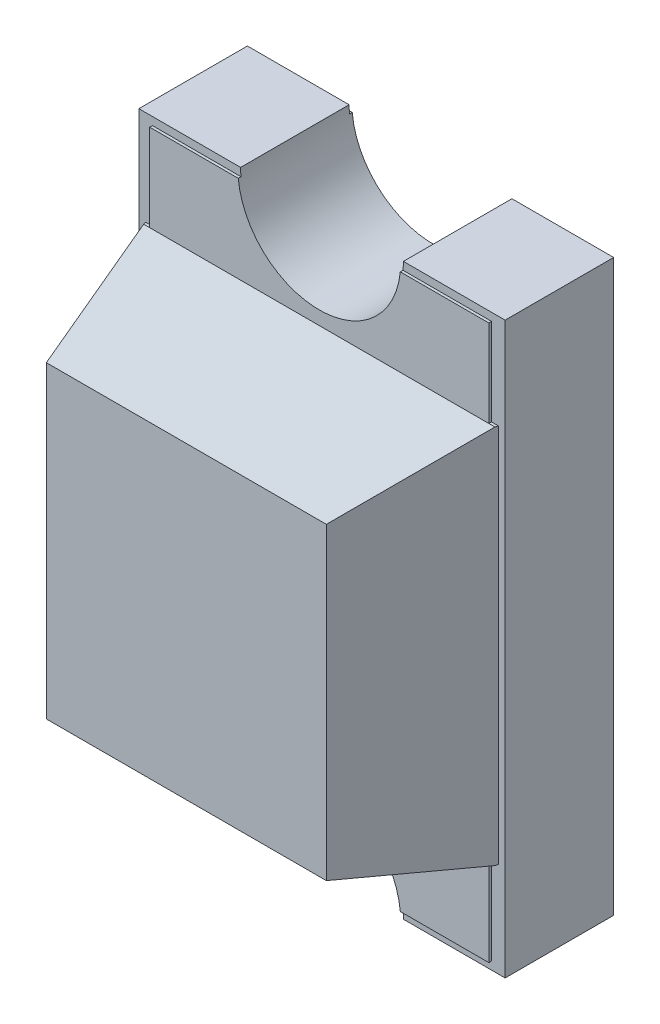
ISO-10303-21;
HEADER;
FILE_DESCRIPTION(('STEP AP214'),'2;1');
FILE_NAME('part.step','',(''),(''),'','','');
FILE_SCHEMA(('AUTOMOTIVE_DESIGN { 1 0 10303 214 1 1 1 1 }'));
ENDSEC;
DATA;
#1=APPLICATION_CONTEXT('core data for automotive mechanical design processes');
#2=APPLICATION_PROTOCOL_DEFINITION('international standard','automotive_design',2000,#1);
#3=PRODUCT_CONTEXT('',#1,'mechanical');
#4=PRODUCT('Part','Part','',(#3));
#5=PRODUCT_RELATED_PRODUCT_CATEGORY('part','',(#4));
#6=PRODUCT_DEFINITION_FORMATION('','',#4);
#7=PRODUCT_DEFINITION_CONTEXT('part definition',#1,'design');
#8=PRODUCT_DEFINITION('design','',#6,#7);
#9=PRODUCT_DEFINITION_SHAPE('','',#8);
#10=(LENGTH_UNIT() NAMED_UNIT(*) SI_UNIT(.MILLI.,.METRE.));
#11=(NAMED_UNIT(*) PLANE_ANGLE_UNIT() SI_UNIT($,.RADIAN.));
#12=(NAMED_UNIT(*) SI_UNIT($,.STERADIAN.) SOLID_ANGLE_UNIT());
#13=UNCERTAINTY_MEASURE_WITH_UNIT(LENGTH_MEASURE(1.E-05),#10,'distance_accuracy_value','');
#14=(GEOMETRIC_REPRESENTATION_CONTEXT(3) GLOBAL_UNCERTAINTY_ASSIGNED_CONTEXT((#13)) GLOBAL_UNIT_ASSIGNED_CONTEXT((#10,
#11,#12)) REPRESENTATION_CONTEXT('',''));
#15=CARTESIAN_POINT('',(0.,0.,0.));
#16=DIRECTION('',(0.,0.,1.));
#17=DIRECTION('',(1.,0.,0.));
#18=AXIS2_PLACEMENT_3D('',#15,#16,#17);
#19=CARTESIAN_POINT('',(-0.65,0.7,0.9));
#20=DIRECTION('',(0.,-1.,0.));
#21=DIRECTION('',(0.,0.,-1.));
#22=AXIS2_PLACEMENT_3D('',#19,#20,#21);
#23=PLANE('',#22);
#24=DIRECTION('',(0.258819045102514,0.,0.96592582628907));
#25=VECTOR('',#24,1.);
#26=CARTESIAN_POINT('',(-0.525000000000003,0.7,0.866506350946111));
#27=LINE('',#26,#25);
#28=CARTESIAN_POINT('',(-0.65,0.7,0.4));
#29=VERTEX_POINT('',#28);
#30=CARTESIAN_POINT('',(-0.647320508075689,0.7,0.41));
#31=VERTEX_POINT('',#30);
#32=EDGE_CURVE('E300',#29,#31,#27,.T.);
#33=ORIENTED_EDGE('',*,*,#32,.T.);
#34=DIRECTION('',(-1.,0.,0.));
#35=VECTOR('',#34,1.);
#36=CARTESIAN_POINT('',(0.675,0.7,0.41));
#37=LINE('',#36,#35);
#38=CARTESIAN_POINT('',(-0.625,0.7,0.41));
#39=VERTEX_POINT('',#38);
#40=EDGE_CURVE('E290',#39,#31,#37,.T.);
#41=ORIENTED_EDGE('',*,*,#40,.F.);
#42=DIRECTION('',(0.,0.,1.));
#43=VECTOR('',#42,1.);
#44=CARTESIAN_POINT('',(-0.625,0.7,-0.00999999999999997));
#45=LINE('',#44,#43);
#46=CARTESIAN_POINT('',(-0.625,0.7,0.4));
#47=VERTEX_POINT('',#46);
#48=EDGE_CURVE('E324',#47,#39,#45,.T.);
#49=ORIENTED_EDGE('',*,*,#48,.F.);
#50=DIRECTION('',(-1.,0.,0.));
#51=VECTOR('',#50,1.);
#52=CARTESIAN_POINT('',(-0.65,0.7,0.4));
#53=LINE('',#52,#51);
#54=EDGE_CURVE('E314',#47,#29,#53,.T.);
#55=ORIENTED_EDGE('',*,*,#54,.T.);
#56=EDGE_LOOP('',(#33,#41,#49,#55));
#57=FACE_BOUND('',#56,.T.);
#58=ADVANCED_FACE('F34',(#57),#23,.F.);
#59=CARTESIAN_POINT('',(-0.65,-0.7,0.9));
#60=DIRECTION('',(0.,1.,0.));
#61=DIRECTION('',(0.,0.,1.));
#62=AXIS2_PLACEMENT_3D('',#59,#60,#61);
#63=PLANE('',#62);
#64=DIRECTION('',(0.258819045102514,0.,-0.96592582628907));
#65=VECTOR('',#64,1.);
#66=CARTESIAN_POINT('',(0.65,-0.7,0.4));
#67=LINE('',#66,#65);
#68=CARTESIAN_POINT('',(0.647320508075689,-0.7,0.41));
#69=VERTEX_POINT('',#68);
#70=CARTESIAN_POINT('',(0.65,-0.7,0.4));
#71=VERTEX_POINT('',#70);
#72=EDGE_CURVE('E297',#69,#71,#67,.T.);
#73=ORIENTED_EDGE('',*,*,#72,.F.);
#74=DIRECTION('',(-1.,0.,0.));
#75=VECTOR('',#74,1.);
#76=CARTESIAN_POINT('',(0.675,-0.7,0.41));
#77=LINE('',#76,#75);
#78=CARTESIAN_POINT('',(0.625,-0.7,0.41));
#79=VERTEX_POINT('',#78);
#80=EDGE_CURVE('E56',#69,#79,#77,.T.);
#81=ORIENTED_EDGE('',*,*,#80,.T.);
#82=DIRECTION('',(0.,0.,1.));
#83=VECTOR('',#82,1.);
#84=CARTESIAN_POINT('',(0.625,-0.7,-0.00999999999999997));
#85=LINE('',#84,#83);
#86=CARTESIAN_POINT('',(0.625,-0.7,0.4));
#87=VERTEX_POINT('',#86);
#88=EDGE_CURVE('E317',#87,#79,#85,.T.);
#89=ORIENTED_EDGE('',*,*,#88,.F.);
#90=DIRECTION('',(1.,0.,0.));
#91=VECTOR('',#90,1.);
#92=CARTESIAN_POINT('',(-0.65,-0.7,0.4));
#93=LINE('',#92,#91);
#94=EDGE_CURVE('E310',#87,#71,#93,.T.);
#95=ORIENTED_EDGE('',*,*,#94,.T.);
#96=EDGE_LOOP('',(#73,#81,#89,#95));
#97=FACE_BOUND('',#96,.T.);
#98=ADVANCED_FACE('F543',(#97),#63,.F.);
#99=CARTESIAN_POINT('',(0.,0.,0.4));
#100=DIRECTION('',(0.,0.,1.));
#101=DIRECTION('',(1.,0.,0.));
#102=AXIS2_PLACEMENT_3D('',#99,#100,#101);
#103=PLANE('',#102);
#104=DIRECTION('',(-1.,0.,0.));
#105=VECTOR('',#104,1.);
#106=CARTESIAN_POINT('',(-0.675,1.05,0.4));
#107=LINE('',#106,#105);
#108=CARTESIAN_POINT('',(-0.3,1.05,0.4));
#109=VERTEX_POINT('',#108);
#110=CARTESIAN_POINT('',(-0.675,1.05,0.4));
#111=VERTEX_POINT('',#110);
#112=EDGE_CURVE('E478',#109,#111,#107,.T.);
#113=ORIENTED_EDGE('',*,*,#112,.T.);
#114=DIRECTION('',(0.,-1.,0.));
#115=VECTOR('',#114,1.);
#116=CARTESIAN_POINT('',(-0.675,1.05,0.4));
#117=LINE('',#116,#115);
#118=CARTESIAN_POINT('',(-0.675,-1.05,0.4));
#119=VERTEX_POINT('',#118);
#120=EDGE_CURVE('E469',#111,#119,#117,.T.);
#121=ORIENTED_EDGE('',*,*,#120,.T.);
#122=DIRECTION('',(1.,0.,0.));
#123=VECTOR('',#122,1.);
#124=CARTESIAN_POINT('',(-0.675,-1.05,0.4));
#125=LINE('',#124,#123);
#126=CARTESIAN_POINT('',(-0.3,-1.05,0.4));
#127=VERTEX_POINT('',#126);
#128=EDGE_CURVE('E473',#119,#127,#125,.T.);
#129=ORIENTED_EDGE('',*,*,#128,.T.);
#130=CARTESIAN_POINT('',(0.,-1.05,0.4));
#131=DIRECTION('',(0.,0.,1.));
#132=DIRECTION('',(1.,0.,0.));
#133=AXIS2_PLACEMENT_3D('',#130,#131,#132);
#134=CIRCLE('',#133,0.3);
#135=CARTESIAN_POINT('',(-0.298588988795972,-1.02093772600433,0.4));
#136=VERTEX_POINT('',#135);
#137=EDGE_CURVE('E334',#136,#127,#134,.T.);
#138=ORIENTED_EDGE('',*,*,#137,.F.);
#139=DIRECTION('',(1.,0.,0.));
#140=VECTOR('',#139,1.);
#141=CARTESIAN_POINT('',(0.,-1.02093772600433,0.4));
#142=LINE('',#141,#140);
#143=CARTESIAN_POINT('',(-0.625,-1.02093772600433,0.4));
#144=VERTEX_POINT('',#143);
#145=EDGE_CURVE('E421',#144,#136,#142,.T.);
#146=ORIENTED_EDGE('',*,*,#145,.F.);
#147=DIRECTION('',(0.,-1.,0.));
#148=VECTOR('',#147,1.);
#149=CARTESIAN_POINT('',(-0.625,0.,0.4));
#150=LINE('',#149,#148);
#151=CARTESIAN_POINT('',(-0.625,-0.7,0.4));
#152=VERTEX_POINT('',#151);
#153=EDGE_CURVE('E418',#152,#144,#150,.T.);
#154=ORIENTED_EDGE('',*,*,#153,.F.);
#155=CARTESIAN_POINT('',(-0.65,-0.7,0.4));
#156=VERTEX_POINT('',#155);
#157=EDGE_CURVE('E311',#156,#152,#93,.T.);
#158=ORIENTED_EDGE('',*,*,#157,.F.);
#159=DIRECTION('',(0.,-1.,0.));
#160=VECTOR('',#159,1.);
#161=CARTESIAN_POINT('',(-0.65,0.7,0.4));
#162=LINE('',#161,#160);
#163=EDGE_CURVE('E308',#29,#156,#162,.T.);
#164=ORIENTED_EDGE('',*,*,#163,.F.);
#165=ORIENTED_EDGE('',*,*,#54,.F.);
#166=DIRECTION('',(0.,-1.,0.));
#167=VECTOR('',#166,1.);
#168=CARTESIAN_POINT('',(-0.625,0.,0.4));
#169=LINE('',#168,#167);
#170=CARTESIAN_POINT('',(-0.625,1.02093772600433,0.4));
#171=VERTEX_POINT('',#170);
#172=EDGE_CURVE('E465',#171,#47,#169,.T.);
#173=ORIENTED_EDGE('',*,*,#172,.F.);
#174=DIRECTION('',(-1.,0.,0.));
#175=VECTOR('',#174,1.);
#176=CARTESIAN_POINT('',(0.,1.02093772600433,0.4));
#177=LINE('',#176,#175);
#178=CARTESIAN_POINT('',(-0.298588988795971,1.02093772600433,0.4));
#179=VERTEX_POINT('',#178);
#180=EDGE_CURVE('E461',#179,#171,#177,.T.);
#181=ORIENTED_EDGE('',*,*,#180,.F.);
#182=CARTESIAN_POINT('',(0.,1.05,0.4));
#183=DIRECTION('',(0.,0.,1.));
#184=DIRECTION('',(1.,0.,0.));
#185=AXIS2_PLACEMENT_3D('',#182,#183,#184);
#186=CIRCLE('',#185,0.3);
#187=EDGE_CURVE('E364',#109,#179,#186,.T.);
#188=ORIENTED_EDGE('',*,*,#187,.F.);
#189=EDGE_LOOP('',(#113,#121,#129,#138,#146,#154,#158,#164,#165,#173,#181,#188));
#190=FACE_BOUND('',#189,.T.);
#191=ADVANCED_FACE('F572',(#190),#103,.T.);
#192=CARTESIAN_POINT('',(0.65,0.7,0.4));
#193=VERTEX_POINT('',#192);
#194=CARTESIAN_POINT('',(0.625,0.7,0.4));
#195=VERTEX_POINT('',#194);
#196=EDGE_CURVE('E315',#193,#195,#53,.T.);
#197=ORIENTED_EDGE('',*,*,#196,.F.);
#198=DIRECTION('',(0.,1.,0.));
#199=VECTOR('',#198,1.);
#200=CARTESIAN_POINT('',(0.65,0.7,0.4));
#201=LINE('',#200,#199);
#202=EDGE_CURVE('E294',#71,#193,#201,.T.);
#203=ORIENTED_EDGE('',*,*,#202,.F.);
#204=ORIENTED_EDGE('',*,*,#94,.F.);
#205=DIRECTION('',(0.,1.,0.));
#206=VECTOR('',#205,1.);
#207=CARTESIAN_POINT('',(0.625,0.,0.4));
#208=LINE('',#207,#206);
#209=CARTESIAN_POINT('',(0.625,-1.02093772600433,0.4));
#210=VERTEX_POINT('',#209);
#211=EDGE_CURVE('E406',#210,#87,#208,.T.);
#212=ORIENTED_EDGE('',*,*,#211,.F.);
#213=CARTESIAN_POINT('',(0.298588988795971,-1.02093772600433,0.4));
#214=VERTEX_POINT('',#213);
#215=EDGE_CURVE('E420',#214,#210,#142,.T.);
#216=ORIENTED_EDGE('',*,*,#215,.F.);
#217=CARTESIAN_POINT('',(0.3,-1.05,0.4));
#218=VERTEX_POINT('',#217);
#219=EDGE_CURVE('E337',#218,#214,#134,.T.);
#220=ORIENTED_EDGE('',*,*,#219,.F.);
#221=CARTESIAN_POINT('',(0.675,-1.05,0.4));
#222=VERTEX_POINT('',#221);
#223=EDGE_CURVE('E471',#218,#222,#125,.T.);
#224=ORIENTED_EDGE('',*,*,#223,.T.);
#225=DIRECTION('',(0.,1.,0.));
#226=VECTOR('',#225,1.);
#227=CARTESIAN_POINT('',(0.675,1.05,0.4));
#228=LINE('',#227,#226);
#229=CARTESIAN_POINT('',(0.675,1.05,0.4));
#230=VERTEX_POINT('',#229);
#231=EDGE_CURVE('E476',#222,#230,#228,.T.);
#232=ORIENTED_EDGE('',*,*,#231,.T.);
#233=CARTESIAN_POINT('',(0.3,1.05,0.4));
#234=VERTEX_POINT('',#233);
#235=EDGE_CURVE('E479',#230,#234,#107,.T.);
#236=ORIENTED_EDGE('',*,*,#235,.T.);
#237=CARTESIAN_POINT('',(0.298588988795972,1.02093772600433,0.4));
#238=VERTEX_POINT('',#237);
#239=EDGE_CURVE('E360',#238,#234,#186,.T.);
#240=ORIENTED_EDGE('',*,*,#239,.F.);
#241=CARTESIAN_POINT('',(0.625,1.02093772600433,0.4));
#242=VERTEX_POINT('',#241);
#243=EDGE_CURVE('E462',#242,#238,#177,.T.);
#244=ORIENTED_EDGE('',*,*,#243,.F.);
#245=DIRECTION('',(0.,1.,0.));
#246=VECTOR('',#245,1.);
#247=CARTESIAN_POINT('',(0.625,0.,0.4));
#248=LINE('',#247,#246);
#249=EDGE_CURVE('E450',#195,#242,#248,.T.);
#250=ORIENTED_EDGE('',*,*,#249,.F.);
#251=EDGE_LOOP('',(#197,#203,#204,#212,#216,#220,#224,#232,#236,#240,#244,#250));
#252=FACE_BOUND('',#251,.T.);
#253=ADVANCED_FACE('F547',(#252),#103,.T.);
#254=CARTESIAN_POINT('',(-0.625,1.02093772600433,-0.00999999999999997));
#255=DIRECTION('',(-1.,0.,0.));
#256=DIRECTION('',(0.,-1.,0.));
#257=AXIS2_PLACEMENT_3D('',#254,#255,#256);
#258=PLANE('',#257);
#259=ORIENTED_EDGE('',*,*,#172,.T.);
#260=ORIENTED_EDGE('',*,*,#48,.T.);
#261=DIRECTION('',(0.,-1.,0.));
#262=VECTOR('',#261,1.);
#263=CARTESIAN_POINT('',(-0.625,1.02093772600433,0.41));
#264=LINE('',#263,#262);
#265=CARTESIAN_POINT('',(-0.625,1.02093772600433,0.41));
#266=VERTEX_POINT('',#265);
#267=EDGE_CURVE('E424',#266,#39,#264,.T.);
#268=ORIENTED_EDGE('',*,*,#267,.F.);
#269=DIRECTION('',(0.,0.,1.));
#270=VECTOR('',#269,1.);
#271=CARTESIAN_POINT('',(-0.625,1.02093772600433,-0.00999999999999997));
#272=LINE('',#271,#270);
#273=EDGE_CURVE('E451',#171,#266,#272,.T.);
#274=ORIENTED_EDGE('',*,*,#273,.F.);
#275=EDGE_LOOP('',(#259,#260,#268,#274));
#276=FACE_BOUND('',#275,.T.);
#277=ADVANCED_FACE('F566',(#276),#258,.T.);
#278=CARTESIAN_POINT('',(0.625,1.02093772600433,-0.00999999999999997));
#279=DIRECTION('',(1.,0.,0.));
#280=DIRECTION('',(0.,1.,0.));
#281=AXIS2_PLACEMENT_3D('',#278,#279,#280);
#282=PLANE('',#281);
#283=DIRECTION('',(0.,1.,0.));
#284=VECTOR('',#283,1.);
#285=CARTESIAN_POINT('',(0.625,1.02093772600433,0.41));
#286=LINE('',#285,#284);
#287=CARTESIAN_POINT('',(0.625,0.7,0.41));
#288=VERTEX_POINT('',#287);
#289=CARTESIAN_POINT('',(0.625,1.02093772600433,0.41));
#290=VERTEX_POINT('',#289);
#291=EDGE_CURVE('E427',#288,#290,#286,.T.);
#292=ORIENTED_EDGE('',*,*,#291,.F.);
#293=DIRECTION('',(0.,0.,-1.));
#294=VECTOR('',#293,1.);
#295=CARTESIAN_POINT('',(0.625,0.7,-0.00999999999999997));
#296=LINE('',#295,#294);
#297=EDGE_CURVE('E288',#288,#195,#296,.T.);
#298=ORIENTED_EDGE('',*,*,#297,.T.);
#299=ORIENTED_EDGE('',*,*,#249,.T.);
#300=DIRECTION('',(0.,0.,1.));
#301=VECTOR('',#300,1.);
#302=CARTESIAN_POINT('',(0.625,1.02093772600433,-0.00999999999999997));
#303=LINE('',#302,#301);
#304=EDGE_CURVE('E455',#242,#290,#303,.T.);
#305=ORIENTED_EDGE('',*,*,#304,.T.);
#306=EDGE_LOOP('',(#292,#298,#299,#305));
#307=FACE_BOUND('',#306,.T.);
#308=ADVANCED_FACE('F552',(#307),#282,.T.);
#309=CARTESIAN_POINT('',(0.,0.,0.41));
#310=DIRECTION('',(0.,0.,1.));
#311=DIRECTION('',(1.,0.,0.));
#312=AXIS2_PLACEMENT_3D('',#309,#310,#311);
#313=PLANE('',#312);
#314=ORIENTED_EDGE('',*,*,#267,.T.);
#315=DIRECTION('',(1.,0.,0.));
#316=VECTOR('',#315,1.);
#317=CARTESIAN_POINT('',(0.,0.7,0.41));
#318=LINE('',#317,#316);
#319=EDGE_CURVE('E533',#39,#288,#318,.T.);
#320=ORIENTED_EDGE('',*,*,#319,.T.);
#321=ORIENTED_EDGE('',*,*,#291,.T.);
#322=DIRECTION('',(-1.,0.,0.));
#323=VECTOR('',#322,1.);
#324=CARTESIAN_POINT('',(-0.625,1.02093772600433,0.41));
#325=LINE('',#324,#323);
#326=CARTESIAN_POINT('',(0.298588988795972,1.02093772600433,0.41));
#327=VERTEX_POINT('',#326);
#328=EDGE_CURVE('E430',#290,#327,#325,.T.);
#329=ORIENTED_EDGE('',*,*,#328,.T.);
#330=CARTESIAN_POINT('',(0.,1.05,0.41));
#331=DIRECTION('',(0.,0.,1.));
#332=DIRECTION('',(1.,0.,0.));
#333=AXIS2_PLACEMENT_3D('',#330,#331,#332);
#334=CIRCLE('',#333,0.3);
#335=CARTESIAN_POINT('',(-0.298588988795971,1.02093772600433,0.41));
#336=VERTEX_POINT('',#335);
#337=EDGE_CURVE('E353',#336,#327,#334,.T.);
#338=ORIENTED_EDGE('',*,*,#337,.F.);
#339=EDGE_CURVE('E429',#336,#266,#325,.T.);
#340=ORIENTED_EDGE('',*,*,#339,.T.);
#341=EDGE_LOOP('',(#314,#320,#321,#329,#338,#340));
#342=FACE_BOUND('',#341,.T.);
#343=ADVANCED_FACE('F557',(#342),#313,.T.);
#344=CARTESIAN_POINT('',(-0.625,-1.02093772600433,-0.00999999999999997));
#345=DIRECTION('',(-1.,0.,0.));
#346=DIRECTION('',(0.,-1.,0.));
#347=AXIS2_PLACEMENT_3D('',#344,#345,#346);
#348=PLANE('',#347);
#349=DIRECTION('',(0.,-1.,0.));
#350=VECTOR('',#349,1.);
#351=CARTESIAN_POINT('',(-0.625,-1.02093772600433,0.41));
#352=LINE('',#351,#350);
#353=CARTESIAN_POINT('',(-0.625,-0.7,0.41));
#354=VERTEX_POINT('',#353);
#355=CARTESIAN_POINT('',(-0.625,-1.02093772600433,0.41));
#356=VERTEX_POINT('',#355);
#357=EDGE_CURVE('E387',#354,#356,#352,.T.);
#358=ORIENTED_EDGE('',*,*,#357,.F.);
#359=DIRECTION('',(0.,0.,-1.));
#360=VECTOR('',#359,1.);
#361=CARTESIAN_POINT('',(-0.625,-0.7,-0.00999999999999997));
#362=LINE('',#361,#360);
#363=EDGE_CURVE('E320',#354,#152,#362,.T.);
#364=ORIENTED_EDGE('',*,*,#363,.T.);
#365=ORIENTED_EDGE('',*,*,#153,.T.);
#366=DIRECTION('',(0.,0.,1.));
#367=VECTOR('',#366,1.);
#368=CARTESIAN_POINT('',(-0.625,-1.02093772600433,-0.00999999999999997));
#369=LINE('',#368,#367);
#370=EDGE_CURVE('E407',#144,#356,#369,.T.);
#371=ORIENTED_EDGE('',*,*,#370,.T.);
#372=EDGE_LOOP('',(#358,#364,#365,#371));
#373=FACE_BOUND('',#372,.T.);
#374=ADVANCED_FACE('F632',(#373),#348,.T.);
#375=CARTESIAN_POINT('',(0.625,-1.02093772600433,-0.00999999999999997));
#376=DIRECTION('',(1.,0.,0.));
#377=DIRECTION('',(0.,1.,0.));
#378=AXIS2_PLACEMENT_3D('',#375,#376,#377);
#379=PLANE('',#378);
#380=ORIENTED_EDGE('',*,*,#211,.T.);
#381=ORIENTED_EDGE('',*,*,#88,.T.);
#382=DIRECTION('',(0.,1.,0.));
#383=VECTOR('',#382,1.);
#384=CARTESIAN_POINT('',(0.625,-1.02093772600433,0.41));
#385=LINE('',#384,#383);
#386=CARTESIAN_POINT('',(0.625,-1.02093772600433,0.41));
#387=VERTEX_POINT('',#386);
#388=EDGE_CURVE('E384',#387,#79,#385,.T.);
#389=ORIENTED_EDGE('',*,*,#388,.F.);
#390=DIRECTION('',(0.,0.,1.));
#391=VECTOR('',#390,1.);
#392=CARTESIAN_POINT('',(0.625,-1.02093772600433,-0.00999999999999997));
#393=LINE('',#392,#391);
#394=EDGE_CURVE('E402',#210,#387,#393,.T.);
#395=ORIENTED_EDGE('',*,*,#394,.F.);
#396=EDGE_LOOP('',(#380,#381,#389,#395));
#397=FACE_BOUND('',#396,.T.);
#398=ADVANCED_FACE('F624',(#397),#379,.T.);
#399=CARTESIAN_POINT('',(0.,0.,0.41));
#400=DIRECTION('',(0.,0.,1.));
#401=DIRECTION('',(1.,0.,0.));
#402=AXIS2_PLACEMENT_3D('',#399,#400,#401);
#403=PLANE('',#402);
#404=ORIENTED_EDGE('',*,*,#388,.T.);
#405=DIRECTION('',(-1.,0.,0.));
#406=VECTOR('',#405,1.);
#407=CARTESIAN_POINT('',(0.,-0.7,0.41));
#408=LINE('',#407,#406);
#409=EDGE_CURVE('E530',#79,#354,#408,.T.);
#410=ORIENTED_EDGE('',*,*,#409,.T.);
#411=ORIENTED_EDGE('',*,*,#357,.T.);
#412=DIRECTION('',(1.,0.,0.));
#413=VECTOR('',#412,1.);
#414=CARTESIAN_POINT('',(-0.625,-1.02093772600433,0.41));
#415=LINE('',#414,#413);
#416=CARTESIAN_POINT('',(-0.298588988795972,-1.02093772600433,0.41));
#417=VERTEX_POINT('',#416);
#418=EDGE_CURVE('E381',#356,#417,#415,.T.);
#419=ORIENTED_EDGE('',*,*,#418,.T.);
#420=CARTESIAN_POINT('',(0.,-1.05,0.41));
#421=DIRECTION('',(0.,0.,1.));
#422=DIRECTION('',(1.,0.,0.));
#423=AXIS2_PLACEMENT_3D('',#420,#421,#422);
#424=CIRCLE('',#423,0.3);
#425=CARTESIAN_POINT('',(0.298588988795971,-1.02093772600433,0.41));
#426=VERTEX_POINT('',#425);
#427=EDGE_CURVE('E327',#426,#417,#424,.T.);
#428=ORIENTED_EDGE('',*,*,#427,.F.);
#429=EDGE_CURVE('E380',#426,#387,#415,.T.);
#430=ORIENTED_EDGE('',*,*,#429,.T.);
#431=EDGE_LOOP('',(#404,#410,#411,#419,#428,#430));
#432=FACE_BOUND('',#431,.T.);
#433=ADVANCED_FACE('F620',(#432),#403,.T.);
#434=CARTESIAN_POINT('',(-0.675,-1.05,0.4));
#435=DIRECTION('',(0.,1.,0.));
#436=DIRECTION('',(0.,0.,1.));
#437=AXIS2_PLACEMENT_3D('',#434,#435,#436);
#438=PLANE('',#437);
#439=DIRECTION('',(1.,0.,0.));
#440=VECTOR('',#439,1.);
#441=CARTESIAN_POINT('',(-0.675,-1.05,0.));
#442=LINE('',#441,#440);
#443=CARTESIAN_POINT('',(-0.675,-1.05,0.));
#444=VERTEX_POINT('',#443);
#445=CARTESIAN_POINT('',(-0.3,-1.05,0.));
#446=VERTEX_POINT('',#445);
#447=EDGE_CURVE('E485',#444,#446,#442,.T.);
#448=ORIENTED_EDGE('',*,*,#447,.T.);
#449=DIRECTION('',(0.,0.,1.));
#450=VECTOR('',#449,1.);
#451=CARTESIAN_POINT('',(-0.3,-1.05,-0.00999999999999997));
#452=LINE('',#451,#450);
#453=EDGE_CURVE('E336',#446,#127,#452,.T.);
#454=ORIENTED_EDGE('',*,*,#453,.T.);
#455=ORIENTED_EDGE('',*,*,#128,.F.);
#456=DIRECTION('',(0.,0.,-1.));
#457=VECTOR('',#456,1.);
#458=CARTESIAN_POINT('',(-0.675,-1.05,0.4));
#459=LINE('',#458,#457);
#460=EDGE_CURVE('E501',#119,#444,#459,.T.);
#461=ORIENTED_EDGE('',*,*,#460,.T.);
#462=EDGE_LOOP('',(#448,#454,#455,#461));
#463=FACE_BOUND('',#462,.T.);
#464=ADVANCED_FACE('F623',(#463),#438,.F.);
#465=CARTESIAN_POINT('',(-0.625,-1.02093772600433,-0.00999999999999997));
#466=DIRECTION('',(0.,-1.,0.));
#467=DIRECTION('',(0.,0.,-1.));
#468=AXIS2_PLACEMENT_3D('',#465,#466,#467);
#469=PLANE('',#468);
#470=DIRECTION('',(0.,0.,1.));
#471=VECTOR('',#470,1.);
#472=CARTESIAN_POINT('',(0.298588988795971,-1.02093772600433,-0.00999999999999997));
#473=LINE('',#472,#471);
#474=CARTESIAN_POINT('',(0.298588988795971,-1.02093772600433,-0.00999999999999997));
#475=VERTEX_POINT('',#474);
#476=CARTESIAN_POINT('',(0.298588988795971,-1.02093772600433,0.));
#477=VERTEX_POINT('',#476);
#478=EDGE_CURVE('E351',#475,#477,#473,.T.);
#479=ORIENTED_EDGE('',*,*,#478,.F.);
#480=DIRECTION('',(1.,0.,0.));
#481=VECTOR('',#480,1.);
#482=CARTESIAN_POINT('',(-0.625,-1.02093772600433,-0.00999999999999997));
#483=LINE('',#482,#481);
#484=CARTESIAN_POINT('',(0.625,-1.02093772600433,-0.00999999999999997));
#485=VERTEX_POINT('',#484);
#486=EDGE_CURVE('E389',#475,#485,#483,.T.);
#487=ORIENTED_EDGE('',*,*,#486,.T.);
#488=CARTESIAN_POINT('',(0.625,-1.02093772600433,0.));
#489=VERTEX_POINT('',#488);
#490=EDGE_CURVE('E413',#485,#489,#393,.T.);
#491=ORIENTED_EDGE('',*,*,#490,.T.);
#492=DIRECTION('',(1.,0.,0.));
#493=VECTOR('',#492,1.);
#494=CARTESIAN_POINT('',(0.,-1.02093772600433,0.));
#495=LINE('',#494,#493);
#496=EDGE_CURVE('E526',#477,#489,#495,.T.);
#497=ORIENTED_EDGE('',*,*,#496,.F.);
#498=EDGE_LOOP('',(#479,#487,#491,#497));
#499=FACE_BOUND('',#498,.T.);
#500=ADVANCED_FACE('F648',(#499),#469,.T.);
#501=DIRECTION('',(0.,0.,1.));
#502=VECTOR('',#501,1.);
#503=CARTESIAN_POINT('',(0.298588988795971,-1.02093772600433,-0.00999999999999997));
#504=LINE('',#503,#502);
#505=EDGE_CURVE('E346',#214,#426,#504,.T.);
#506=ORIENTED_EDGE('',*,*,#505,.F.);
#507=ORIENTED_EDGE('',*,*,#215,.T.);
#508=ORIENTED_EDGE('',*,*,#394,.T.);
#509=ORIENTED_EDGE('',*,*,#429,.F.);
#510=EDGE_LOOP('',(#506,#507,#508,#509));
#511=FACE_BOUND('',#510,.T.);
#512=ADVANCED_FACE('F698',(#511),#469,.T.);
#513=CARTESIAN_POINT('',(-0.675,1.05,0.4));
#514=DIRECTION('',(0.,-1.,0.));
#515=DIRECTION('',(0.,0.,-1.));
#516=AXIS2_PLACEMENT_3D('',#513,#514,#515);
#517=PLANE('',#516);
#518=DIRECTION('',(-1.,0.,0.));
#519=VECTOR('',#518,1.);
#520=CARTESIAN_POINT('',(-0.675,1.05,0.));
#521=LINE('',#520,#519);
#522=CARTESIAN_POINT('',(0.675,1.05,0.));
#523=VERTEX_POINT('',#522);
#524=CARTESIAN_POINT('',(0.3,1.05,0.));
#525=VERTEX_POINT('',#524);
#526=EDGE_CURVE('E472',#523,#525,#521,.T.);
#527=ORIENTED_EDGE('',*,*,#526,.T.);
#528=DIRECTION('',(0.,0.,1.));
#529=VECTOR('',#528,1.);
#530=CARTESIAN_POINT('',(0.3,1.05,-0.00999999999999997));
#531=LINE('',#530,#529);
#532=EDGE_CURVE('E363',#525,#234,#531,.T.);
#533=ORIENTED_EDGE('',*,*,#532,.T.);
#534=ORIENTED_EDGE('',*,*,#235,.F.);
#535=DIRECTION('',(0.,0.,-1.));
#536=VECTOR('',#535,1.);
#537=CARTESIAN_POINT('',(0.675,1.05,0.4));
#538=LINE('',#537,#536);
#539=EDGE_CURVE('E495',#230,#523,#538,.T.);
#540=ORIENTED_EDGE('',*,*,#539,.T.);
#541=EDGE_LOOP('',(#527,#533,#534,#540));
#542=FACE_BOUND('',#541,.T.);
#543=ADVANCED_FACE('F681',(#542),#517,.F.);
#544=CARTESIAN_POINT('',(-0.625,1.02093772600433,-0.00999999999999997));
#545=DIRECTION('',(0.,1.,0.));
#546=DIRECTION('',(0.,0.,1.));
#547=AXIS2_PLACEMENT_3D('',#544,#545,#546);
#548=PLANE('',#547);
#549=DIRECTION('',(0.,0.,1.));
#550=VECTOR('',#549,1.);
#551=CARTESIAN_POINT('',(-0.298588988795971,1.02093772600433,-0.00999999999999997));
#552=LINE('',#551,#550);
#553=CARTESIAN_POINT('',(-0.298588988795971,1.02093772600433,-0.00999999999999997));
#554=VERTEX_POINT('',#553);
#555=CARTESIAN_POINT('',(-0.298588988795971,1.02093772600433,0.));
#556=VERTEX_POINT('',#555);
#557=EDGE_CURVE('E378',#554,#556,#552,.T.);
#558=ORIENTED_EDGE('',*,*,#557,.F.);
#559=DIRECTION('',(-1.,0.,0.));
#560=VECTOR('',#559,1.);
#561=CARTESIAN_POINT('',(-0.625,1.02093772600433,-0.00999999999999997));
#562=LINE('',#561,#560);
#563=CARTESIAN_POINT('',(-0.625,1.02093772600433,-0.00999999999999997));
#564=VERTEX_POINT('',#563);
#565=EDGE_CURVE('E442',#554,#564,#562,.T.);
#566=ORIENTED_EDGE('',*,*,#565,.T.);
#567=CARTESIAN_POINT('',(-0.625,1.02093772600433,0.));
#568=VERTEX_POINT('',#567);
#569=EDGE_CURVE('E447',#564,#568,#272,.T.);
#570=ORIENTED_EDGE('',*,*,#569,.T.);
#571=DIRECTION('',(-1.,0.,0.));
#572=VECTOR('',#571,1.);
#573=CARTESIAN_POINT('',(0.,1.02093772600433,0.));
#574=LINE('',#573,#572);
#575=EDGE_CURVE('E510',#556,#568,#574,.T.);
#576=ORIENTED_EDGE('',*,*,#575,.F.);
#577=EDGE_LOOP('',(#558,#566,#570,#576));
#578=FACE_BOUND('',#577,.T.);
#579=ADVANCED_FACE('F661',(#578),#548,.T.);
#580=DIRECTION('',(0.,0.,1.));
#581=VECTOR('',#580,1.);
#582=CARTESIAN_POINT('',(-0.298588988795971,1.02093772600433,-0.00999999999999997));
#583=LINE('',#582,#581);
#584=EDGE_CURVE('E373',#179,#336,#583,.T.);
#585=ORIENTED_EDGE('',*,*,#584,.F.);
#586=ORIENTED_EDGE('',*,*,#180,.T.);
#587=ORIENTED_EDGE('',*,*,#273,.T.);
#588=ORIENTED_EDGE('',*,*,#339,.F.);
#589=EDGE_LOOP('',(#585,#586,#587,#588));
#590=FACE_BOUND('',#589,.T.);
#591=ADVANCED_FACE('F690',(#590),#548,.T.);
#592=CARTESIAN_POINT('',(-0.675,1.05,0.4));
#593=DIRECTION('',(1.,0.,0.));
#594=DIRECTION('',(0.,0.,-1.));
#595=AXIS2_PLACEMENT_3D('',#592,#593,#594);
#596=PLANE('',#595);
#597=DIRECTION('',(0.,-1.,0.));
#598=VECTOR('',#597,1.);
#599=CARTESIAN_POINT('',(-0.675,1.05,0.));
#600=LINE('',#599,#598);
#601=CARTESIAN_POINT('',(-0.675,1.05,0.));
#602=VERTEX_POINT('',#601);
#603=EDGE_CURVE('E468',#602,#444,#600,.T.);
#604=ORIENTED_EDGE('',*,*,#603,.T.);
#605=ORIENTED_EDGE('',*,*,#460,.F.);
#606=ORIENTED_EDGE('',*,*,#120,.F.);
#607=DIRECTION('',(0.,0.,-1.));
#608=VECTOR('',#607,1.);
#609=CARTESIAN_POINT('',(-0.675,1.05,0.4));
#610=LINE('',#609,#608);
#611=EDGE_CURVE('E481',#111,#602,#610,.T.);
#612=ORIENTED_EDGE('',*,*,#611,.T.);
#613=EDGE_LOOP('',(#604,#605,#606,#612));
#614=FACE_BOUND('',#613,.T.);
#615=ADVANCED_FACE('F36',(#614),#596,.F.);
#616=ORIENTED_EDGE('',*,*,#223,.F.);
#617=DIRECTION('',(0.,0.,1.));
#618=VECTOR('',#617,1.);
#619=CARTESIAN_POINT('',(0.3,-1.05,-0.00999999999999997));
#620=LINE('',#619,#618);
#621=CARTESIAN_POINT('',(0.3,-1.05,0.));
#622=VERTEX_POINT('',#621);
#623=EDGE_CURVE('E348',#218,#622,#620,.F.);
#624=ORIENTED_EDGE('',*,*,#623,.T.);
#625=CARTESIAN_POINT('',(0.675,-1.05,0.));
#626=VERTEX_POINT('',#625);
#627=EDGE_CURVE('E484',#622,#626,#442,.T.);
#628=ORIENTED_EDGE('',*,*,#627,.T.);
#629=DIRECTION('',(0.,0.,-1.));
#630=VECTOR('',#629,1.);
#631=CARTESIAN_POINT('',(0.675,-1.05,0.4));
#632=LINE('',#631,#630);
#633=EDGE_CURVE('E498',#222,#626,#632,.T.);
#634=ORIENTED_EDGE('',*,*,#633,.F.);
#635=EDGE_LOOP('',(#616,#624,#628,#634));
#636=FACE_BOUND('',#635,.T.);
#637=ADVANCED_FACE('F683',(#636),#438,.F.);
#638=CARTESIAN_POINT('',(0.675,1.05,0.4));
#639=DIRECTION('',(-1.,0.,0.));
#640=DIRECTION('',(0.,0.,1.));
#641=AXIS2_PLACEMENT_3D('',#638,#639,#640);
#642=PLANE('',#641);
#643=DIRECTION('',(0.,1.,0.));
#644=VECTOR('',#643,1.);
#645=CARTESIAN_POINT('',(0.675,1.05,0.));
#646=LINE('',#645,#644);
#647=EDGE_CURVE('E488',#626,#523,#646,.T.);
#648=ORIENTED_EDGE('',*,*,#647,.T.);
#649=ORIENTED_EDGE('',*,*,#539,.F.);
#650=ORIENTED_EDGE('',*,*,#231,.F.);
#651=ORIENTED_EDGE('',*,*,#633,.T.);
#652=EDGE_LOOP('',(#648,#649,#650,#651));
#653=FACE_BOUND('',#652,.T.);
#654=ADVANCED_FACE('F679',(#653),#642,.F.);
#655=ORIENTED_EDGE('',*,*,#112,.F.);
#656=DIRECTION('',(0.,0.,1.));
#657=VECTOR('',#656,1.);
#658=CARTESIAN_POINT('',(-0.3,1.05,-0.00999999999999997));
#659=LINE('',#658,#657);
#660=CARTESIAN_POINT('',(-0.3,1.05,0.));
#661=VERTEX_POINT('',#660);
#662=EDGE_CURVE('E375',#109,#661,#659,.F.);
#663=ORIENTED_EDGE('',*,*,#662,.T.);
#664=EDGE_CURVE('E490',#661,#602,#521,.T.);
#665=ORIENTED_EDGE('',*,*,#664,.T.);
#666=ORIENTED_EDGE('',*,*,#611,.F.);
#667=EDGE_LOOP('',(#655,#663,#665,#666));
#668=FACE_BOUND('',#667,.T.);
#669=ADVANCED_FACE('F675',(#668),#517,.F.);
#670=CARTESIAN_POINT('',(0.,0.,0.));
#671=DIRECTION('',(0.,0.,1.));
#672=DIRECTION('',(1.,0.,0.));
#673=AXIS2_PLACEMENT_3D('',#670,#671,#672);
#674=PLANE('',#673);
#675=ORIENTED_EDGE('',*,*,#627,.F.);
#676=CARTESIAN_POINT('',(0.,-1.05,0.));
#677=DIRECTION('',(0.,0.,1.));
#678=DIRECTION('',(1.,0.,0.));
#679=AXIS2_PLACEMENT_3D('',#676,#677,#678);
#680=CIRCLE('',#679,0.3);
#681=EDGE_CURVE('E344',#622,#477,#680,.T.);
#682=ORIENTED_EDGE('',*,*,#681,.T.);
#683=ORIENTED_EDGE('',*,*,#496,.T.);
#684=DIRECTION('',(0.,1.,0.));
#685=VECTOR('',#684,1.);
#686=CARTESIAN_POINT('',(0.625,0.,0.));
#687=LINE('',#686,#685);
#688=CARTESIAN_POINT('',(0.625,-0.520937726004333,0.));
#689=VERTEX_POINT('',#688);
#690=EDGE_CURVE('E517',#489,#689,#687,.T.);
#691=ORIENTED_EDGE('',*,*,#690,.T.);
#692=DIRECTION('',(-1.,0.,0.));
#693=VECTOR('',#692,1.);
#694=CARTESIAN_POINT('',(0.,-0.520937726004333,0.));
#695=LINE('',#694,#693);
#696=CARTESIAN_POINT('',(-0.625,-0.520937726004333,0.));
#697=VERTEX_POINT('',#696);
#698=EDGE_CURVE('E520',#689,#697,#695,.T.);
#699=ORIENTED_EDGE('',*,*,#698,.T.);
#700=DIRECTION('',(0.,-1.,0.));
#701=VECTOR('',#700,1.);
#702=CARTESIAN_POINT('',(-0.625,0.,0.));
#703=LINE('',#702,#701);
#704=CARTESIAN_POINT('',(-0.625,-1.02093772600433,0.));
#705=VERTEX_POINT('',#704);
#706=EDGE_CURVE('E523',#697,#705,#703,.T.);
#707=ORIENTED_EDGE('',*,*,#706,.T.);
#708=CARTESIAN_POINT('',(-0.298588988795972,-1.02093772600433,0.));
#709=VERTEX_POINT('',#708);
#710=EDGE_CURVE('E527',#705,#709,#495,.T.);
#711=ORIENTED_EDGE('',*,*,#710,.T.);
#712=EDGE_CURVE('E340',#709,#446,#680,.T.);
#713=ORIENTED_EDGE('',*,*,#712,.T.);
#714=ORIENTED_EDGE('',*,*,#447,.F.);
#715=ORIENTED_EDGE('',*,*,#603,.F.);
#716=ORIENTED_EDGE('',*,*,#664,.F.);
#717=CARTESIAN_POINT('',(0.,1.05,0.));
#718=DIRECTION('',(0.,0.,1.));
#719=DIRECTION('',(1.,0.,0.));
#720=AXIS2_PLACEMENT_3D('',#717,#718,#719);
#721=CIRCLE('',#720,0.3);
#722=EDGE_CURVE('E371',#661,#556,#721,.T.);
#723=ORIENTED_EDGE('',*,*,#722,.T.);
#724=ORIENTED_EDGE('',*,*,#575,.T.);
#725=DIRECTION('',(0.,-1.,0.));
#726=VECTOR('',#725,1.);
#727=CARTESIAN_POINT('',(-0.625,0.,0.));
#728=LINE('',#727,#726);
#729=CARTESIAN_POINT('',(-0.625,0.520937726004333,0.));
#730=VERTEX_POINT('',#729);
#731=EDGE_CURVE('E514',#568,#730,#728,.T.);
#732=ORIENTED_EDGE('',*,*,#731,.T.);
#733=DIRECTION('',(1.,0.,0.));
#734=VECTOR('',#733,1.);
#735=CARTESIAN_POINT('',(0.,0.520937726004333,0.));
#736=LINE('',#735,#734);
#737=CARTESIAN_POINT('',(0.625,0.520937726004333,0.));
#738=VERTEX_POINT('',#737);
#739=EDGE_CURVE('E504',#730,#738,#736,.T.);
#740=ORIENTED_EDGE('',*,*,#739,.T.);
#741=DIRECTION('',(0.,1.,0.));
#742=VECTOR('',#741,1.);
#743=CARTESIAN_POINT('',(0.625,0.,0.));
#744=LINE('',#743,#742);
#745=CARTESIAN_POINT('',(0.625,1.02093772600433,0.));
#746=VERTEX_POINT('',#745);
#747=EDGE_CURVE('E507',#738,#746,#744,.T.);
#748=ORIENTED_EDGE('',*,*,#747,.T.);
#749=CARTESIAN_POINT('',(0.298588988795972,1.02093772600433,0.));
#750=VERTEX_POINT('',#749);
#751=EDGE_CURVE('E511',#746,#750,#574,.T.);
#752=ORIENTED_EDGE('',*,*,#751,.T.);
#753=EDGE_CURVE('E367',#750,#525,#721,.T.);
#754=ORIENTED_EDGE('',*,*,#753,.T.);
#755=ORIENTED_EDGE('',*,*,#526,.F.);
#756=ORIENTED_EDGE('',*,*,#647,.F.);
#757=EDGE_LOOP('',(#675,#682,#683,#691,#699,#707,#711,#713,#714,#715,#716,#723,#724,#732,#740,
#748,#752,#754,#755,#756));
#758=FACE_BOUND('',#757,.T.);
#759=ADVANCED_FACE('F655',(#758),#674,.F.);
#760=CARTESIAN_POINT('',(0.,0.,-0.00999999999999997));
#761=DIRECTION('',(0.,0.,1.));
#762=DIRECTION('',(1.,0.,0.));
#763=AXIS2_PLACEMENT_3D('',#760,#761,#762);
#764=PLANE('',#763);
#765=ORIENTED_EDGE('',*,*,#565,.F.);
#766=CARTESIAN_POINT('',(0.,1.05,-0.00999999999999997));
#767=DIRECTION('',(0.,0.,1.));
#768=DIRECTION('',(1.,0.,0.));
#769=AXIS2_PLACEMENT_3D('',#766,#767,#768);
#770=CIRCLE('',#769,0.3);
#771=CARTESIAN_POINT('',(0.298588988795972,1.02093772600433,-0.00999999999999997));
#772=VERTEX_POINT('',#771);
#773=EDGE_CURVE('E355',#554,#772,#770,.T.);
#774=ORIENTED_EDGE('',*,*,#773,.T.);
#775=CARTESIAN_POINT('',(0.625,1.02093772600433,-0.00999999999999997));
#776=VERTEX_POINT('',#775);
#777=EDGE_CURVE('E443',#776,#772,#562,.T.);
#778=ORIENTED_EDGE('',*,*,#777,.F.);
#779=DIRECTION('',(0.,1.,0.));
#780=VECTOR('',#779,1.);
#781=CARTESIAN_POINT('',(0.625,1.02093772600433,-0.00999999999999997));
#782=LINE('',#781,#780);
#783=CARTESIAN_POINT('',(0.625,0.520937726004333,-0.00999999999999997));
#784=VERTEX_POINT('',#783);
#785=EDGE_CURVE('E439',#784,#776,#782,.T.);
#786=ORIENTED_EDGE('',*,*,#785,.F.);
#787=DIRECTION('',(1.,0.,0.));
#788=VECTOR('',#787,1.);
#789=CARTESIAN_POINT('',(-0.625,0.520937726004333,-0.00999999999999997));
#790=LINE('',#789,#788);
#791=CARTESIAN_POINT('',(-0.625,0.520937726004333,-0.00999999999999997));
#792=VERTEX_POINT('',#791);
#793=EDGE_CURVE('E436',#792,#784,#790,.T.);
#794=ORIENTED_EDGE('',*,*,#793,.F.);
#795=DIRECTION('',(0.,-1.,0.));
#796=VECTOR('',#795,1.);
#797=CARTESIAN_POINT('',(-0.625,1.02093772600433,-0.00999999999999997));
#798=LINE('',#797,#796);
#799=EDGE_CURVE('E433',#564,#792,#798,.T.);
#800=ORIENTED_EDGE('',*,*,#799,.F.);
#801=EDGE_LOOP('',(#765,#774,#778,#786,#794,#800));
#802=FACE_BOUND('',#801,.T.);
#803=ADVANCED_FACE('F651',(#802),#764,.F.);
#804=CARTESIAN_POINT('',(-0.625,0.520937726004333,-0.00999999999999997));
#805=DIRECTION('',(0.,-1.,0.));
#806=DIRECTION('',(0.,0.,-1.));
#807=AXIS2_PLACEMENT_3D('',#804,#805,#806);
#808=PLANE('',#807);
#809=ORIENTED_EDGE('',*,*,#739,.F.);
#810=DIRECTION('',(0.,0.,1.));
#811=VECTOR('',#810,1.);
#812=CARTESIAN_POINT('',(-0.625,0.520937726004333,-0.00999999999999997));
#813=LINE('',#812,#811);
#814=EDGE_CURVE('E446',#792,#730,#813,.T.);
#815=ORIENTED_EDGE('',*,*,#814,.F.);
#816=ORIENTED_EDGE('',*,*,#793,.T.);
#817=DIRECTION('',(0.,0.,1.));
#818=VECTOR('',#817,1.);
#819=CARTESIAN_POINT('',(0.625,0.520937726004333,-0.00999999999999997));
#820=LINE('',#819,#818);
#821=EDGE_CURVE('E456',#784,#738,#820,.T.);
#822=ORIENTED_EDGE('',*,*,#821,.T.);
#823=EDGE_LOOP('',(#809,#815,#816,#822));
#824=FACE_BOUND('',#823,.T.);
#825=ADVANCED_FACE('F654',(#824),#808,.T.);
#826=ORIENTED_EDGE('',*,*,#747,.F.);
#827=ORIENTED_EDGE('',*,*,#821,.F.);
#828=ORIENTED_EDGE('',*,*,#785,.T.);
#829=EDGE_CURVE('E452',#776,#746,#303,.T.);
#830=ORIENTED_EDGE('',*,*,#829,.T.);
#831=EDGE_LOOP('',(#826,#827,#828,#830));
#832=FACE_BOUND('',#831,.T.);
#833=ADVANCED_FACE('F665',(#832),#282,.T.);
#834=DIRECTION('',(0.,0.,1.));
#835=VECTOR('',#834,1.);
#836=CARTESIAN_POINT('',(0.298588988795972,1.02093772600433,-0.00999999999999997));
#837=LINE('',#836,#835);
#838=EDGE_CURVE('E370',#750,#772,#837,.F.);
#839=ORIENTED_EDGE('',*,*,#838,.F.);
#840=ORIENTED_EDGE('',*,*,#751,.F.);
#841=ORIENTED_EDGE('',*,*,#829,.F.);
#842=ORIENTED_EDGE('',*,*,#777,.T.);
#843=EDGE_LOOP('',(#839,#840,#841,#842));
#844=FACE_BOUND('',#843,.T.);
#845=ADVANCED_FACE('F662',(#844),#548,.T.);
#846=ORIENTED_EDGE('',*,*,#731,.F.);
#847=ORIENTED_EDGE('',*,*,#569,.F.);
#848=ORIENTED_EDGE('',*,*,#799,.T.);
#849=ORIENTED_EDGE('',*,*,#814,.T.);
#850=EDGE_LOOP('',(#846,#847,#848,#849));
#851=FACE_BOUND('',#850,.T.);
#852=ADVANCED_FACE('F659',(#851),#258,.T.);
#853=DIRECTION('',(0.,0.,1.));
#854=VECTOR('',#853,1.);
#855=CARTESIAN_POINT('',(0.298588988795972,1.02093772600433,-0.00999999999999997));
#856=LINE('',#855,#854);
#857=EDGE_CURVE('E358',#327,#238,#856,.F.);
#858=ORIENTED_EDGE('',*,*,#857,.F.);
#859=ORIENTED_EDGE('',*,*,#328,.F.);
#860=ORIENTED_EDGE('',*,*,#304,.F.);
#861=ORIENTED_EDGE('',*,*,#243,.T.);
#862=EDGE_LOOP('',(#858,#859,#860,#861));
#863=FACE_BOUND('',#862,.T.);
#864=ADVANCED_FACE('F630',(#863),#548,.T.);
#865=CARTESIAN_POINT('',(0.,0.,-0.00999999999999997));
#866=DIRECTION('',(0.,0.,1.));
#867=DIRECTION('',(1.,0.,0.));
#868=AXIS2_PLACEMENT_3D('',#865,#866,#867);
#869=PLANE('',#868);
#870=ORIENTED_EDGE('',*,*,#486,.F.);
#871=CARTESIAN_POINT('',(0.,-1.05,-0.00999999999999997));
#872=DIRECTION('',(0.,0.,1.));
#873=DIRECTION('',(1.,0.,0.));
#874=AXIS2_PLACEMENT_3D('',#871,#872,#873);
#875=CIRCLE('',#874,0.3);
#876=CARTESIAN_POINT('',(-0.298588988795972,-1.02093772600433,-0.00999999999999997));
#877=VERTEX_POINT('',#876);
#878=EDGE_CURVE('E329',#475,#877,#875,.T.);
#879=ORIENTED_EDGE('',*,*,#878,.T.);
#880=CARTESIAN_POINT('',(-0.625,-1.02093772600433,-0.00999999999999997));
#881=VERTEX_POINT('',#880);
#882=EDGE_CURVE('E390',#881,#877,#483,.T.);
#883=ORIENTED_EDGE('',*,*,#882,.F.);
#884=DIRECTION('',(0.,-1.,0.));
#885=VECTOR('',#884,1.);
#886=CARTESIAN_POINT('',(-0.625,-1.02093772600433,-0.00999999999999997));
#887=LINE('',#886,#885);
#888=CARTESIAN_POINT('',(-0.625,-0.520937726004333,-0.00999999999999997));
#889=VERTEX_POINT('',#888);
#890=EDGE_CURVE('E399',#889,#881,#887,.T.);
#891=ORIENTED_EDGE('',*,*,#890,.F.);
#892=DIRECTION('',(-1.,0.,0.));
#893=VECTOR('',#892,1.);
#894=CARTESIAN_POINT('',(-0.625,-0.520937726004333,-0.00999999999999997));
#895=LINE('',#894,#893);
#896=CARTESIAN_POINT('',(0.625,-0.520937726004333,-0.00999999999999997));
#897=VERTEX_POINT('',#896);
#898=EDGE_CURVE('E396',#897,#889,#895,.T.);
#899=ORIENTED_EDGE('',*,*,#898,.F.);
#900=DIRECTION('',(0.,1.,0.));
#901=VECTOR('',#900,1.);
#902=CARTESIAN_POINT('',(0.625,-1.02093772600433,-0.00999999999999997));
#903=LINE('',#902,#901);
#904=EDGE_CURVE('E393',#485,#897,#903,.T.);
#905=ORIENTED_EDGE('',*,*,#904,.F.);
#906=EDGE_LOOP('',(#870,#879,#883,#891,#899,#905));
#907=FACE_BOUND('',#906,.T.);
#908=ADVANCED_FACE('F626',(#907),#869,.F.);
#909=ORIENTED_EDGE('',*,*,#690,.F.);
#910=ORIENTED_EDGE('',*,*,#490,.F.);
#911=ORIENTED_EDGE('',*,*,#904,.T.);
#912=DIRECTION('',(0.,0.,1.));
#913=VECTOR('',#912,1.);
#914=CARTESIAN_POINT('',(0.625,-0.520937726004333,-0.00999999999999997));
#915=LINE('',#914,#913);
#916=EDGE_CURVE('E411',#897,#689,#915,.T.);
#917=ORIENTED_EDGE('',*,*,#916,.T.);
#918=EDGE_LOOP('',(#909,#910,#911,#917));
#919=FACE_BOUND('',#918,.T.);
#920=ADVANCED_FACE('F629',(#919),#379,.T.);
#921=CARTESIAN_POINT('',(-0.625,-0.520937726004333,-0.00999999999999997));
#922=DIRECTION('',(0.,1.,0.));
#923=DIRECTION('',(0.,0.,1.));
#924=AXIS2_PLACEMENT_3D('',#921,#922,#923);
#925=PLANE('',#924);
#926=ORIENTED_EDGE('',*,*,#698,.F.);
#927=ORIENTED_EDGE('',*,*,#916,.F.);
#928=ORIENTED_EDGE('',*,*,#898,.T.);
#929=DIRECTION('',(0.,0.,1.));
#930=VECTOR('',#929,1.);
#931=CARTESIAN_POINT('',(-0.625,-0.520937726004333,-0.00999999999999997));
#932=LINE('',#931,#930);
#933=EDGE_CURVE('E408',#889,#697,#932,.T.);
#934=ORIENTED_EDGE('',*,*,#933,.T.);
#935=EDGE_LOOP('',(#926,#927,#928,#934));
#936=FACE_BOUND('',#935,.T.);
#937=ADVANCED_FACE('F637',(#936),#925,.T.);
#938=ORIENTED_EDGE('',*,*,#706,.F.);
#939=ORIENTED_EDGE('',*,*,#933,.F.);
#940=ORIENTED_EDGE('',*,*,#890,.T.);
#941=EDGE_CURVE('E403',#881,#705,#369,.T.);
#942=ORIENTED_EDGE('',*,*,#941,.T.);
#943=EDGE_LOOP('',(#938,#939,#940,#942));
#944=FACE_BOUND('',#943,.T.);
#945=ADVANCED_FACE('F636',(#944),#348,.T.);
#946=DIRECTION('',(0.,0.,1.));
#947=VECTOR('',#946,1.);
#948=CARTESIAN_POINT('',(-0.298588988795972,-1.02093772600433,-0.00999999999999997));
#949=LINE('',#948,#947);
#950=EDGE_CURVE('E343',#709,#877,#949,.F.);
#951=ORIENTED_EDGE('',*,*,#950,.F.);
#952=ORIENTED_EDGE('',*,*,#710,.F.);
#953=ORIENTED_EDGE('',*,*,#941,.F.);
#954=ORIENTED_EDGE('',*,*,#882,.T.);
#955=EDGE_LOOP('',(#951,#952,#953,#954));
#956=FACE_BOUND('',#955,.T.);
#957=ADVANCED_FACE('F646',(#956),#469,.T.);
#958=DIRECTION('',(0.,0.,1.));
#959=VECTOR('',#958,1.);
#960=CARTESIAN_POINT('',(-0.298588988795972,-1.02093772600433,-0.00999999999999997));
#961=LINE('',#960,#959);
#962=EDGE_CURVE('E332',#417,#136,#961,.F.);
#963=ORIENTED_EDGE('',*,*,#962,.F.);
#964=ORIENTED_EDGE('',*,*,#418,.F.);
#965=ORIENTED_EDGE('',*,*,#370,.F.);
#966=ORIENTED_EDGE('',*,*,#145,.T.);
#967=EDGE_LOOP('',(#963,#964,#965,#966));
#968=FACE_BOUND('',#967,.T.);
#969=ADVANCED_FACE('F618',(#968),#469,.T.);
#970=CARTESIAN_POINT('',(0.,1.05,-0.00999999999999997));
#971=DIRECTION('',(0.,0.,1.));
#972=DIRECTION('',(1.,0.,0.));
#973=AXIS2_PLACEMENT_3D('',#970,#971,#972);
#974=CYLINDRICAL_SURFACE('',#973,0.3);
#975=ORIENTED_EDGE('',*,*,#557,.T.);
#976=ORIENTED_EDGE('',*,*,#722,.F.);
#977=ORIENTED_EDGE('',*,*,#662,.F.);
#978=ORIENTED_EDGE('',*,*,#187,.T.);
#979=ORIENTED_EDGE('',*,*,#584,.T.);
#980=ORIENTED_EDGE('',*,*,#337,.T.);
#981=ORIENTED_EDGE('',*,*,#857,.T.);
#982=ORIENTED_EDGE('',*,*,#239,.T.);
#983=ORIENTED_EDGE('',*,*,#532,.F.);
#984=ORIENTED_EDGE('',*,*,#753,.F.);
#985=ORIENTED_EDGE('',*,*,#838,.T.);
#986=ORIENTED_EDGE('',*,*,#773,.F.);
#987=EDGE_LOOP('',(#975,#976,#977,#978,#979,#980,#981,#982,#983,#984,#985,#986));
#988=FACE_BOUND('',#987,.T.);
#989=ADVANCED_FACE('F614',(#988),#974,.F.);
#990=CARTESIAN_POINT('',(0.,-1.05,-0.00999999999999997));
#991=DIRECTION('',(0.,0.,1.));
#992=DIRECTION('',(1.,0.,0.));
#993=AXIS2_PLACEMENT_3D('',#990,#991,#992);
#994=CYLINDRICAL_SURFACE('',#993,0.3);
#995=ORIENTED_EDGE('',*,*,#478,.T.);
#996=ORIENTED_EDGE('',*,*,#681,.F.);
#997=ORIENTED_EDGE('',*,*,#623,.F.);
#998=ORIENTED_EDGE('',*,*,#219,.T.);
#999=ORIENTED_EDGE('',*,*,#505,.T.);
#1000=ORIENTED_EDGE('',*,*,#427,.T.);
#1001=ORIENTED_EDGE('',*,*,#962,.T.);
#1002=ORIENTED_EDGE('',*,*,#137,.T.);
#1003=ORIENTED_EDGE('',*,*,#453,.F.);
#1004=ORIENTED_EDGE('',*,*,#712,.F.);
#1005=ORIENTED_EDGE('',*,*,#950,.T.);
#1006=ORIENTED_EDGE('',*,*,#878,.F.);
#1007=EDGE_LOOP('',(#995,#996,#997,#998,#999,#1000,#1001,#1002,#1003,#1004,#1005,#1006));
#1008=FACE_BOUND('',#1007,.T.);
#1009=ADVANCED_FACE('F611',(#1008),#994,.F.);
#1010=ORIENTED_EDGE('',*,*,#363,.F.);
#1011=CARTESIAN_POINT('',(-0.647320508075689,-0.7,0.41));
#1012=VERTEX_POINT('',#1011);
#1013=EDGE_CURVE('E585',#354,#1012,#77,.T.);
#1014=ORIENTED_EDGE('',*,*,#1013,.T.);
#1015=DIRECTION('',(0.258819045102514,0.,0.96592582628907));
#1016=VECTOR('',#1015,1.);
#1017=CARTESIAN_POINT('',(-0.65,-0.7,0.4));
#1018=LINE('',#1017,#1016);
#1019=EDGE_CURVE('E296',#156,#1012,#1018,.T.);
#1020=ORIENTED_EDGE('',*,*,#1019,.F.);
#1021=ORIENTED_EDGE('',*,*,#157,.T.);
#1022=EDGE_LOOP('',(#1010,#1014,#1020,#1021));
#1023=FACE_BOUND('',#1022,.T.);
#1024=ADVANCED_FACE('F584',(#1023),#63,.F.);
#1025=ORIENTED_EDGE('',*,*,#297,.F.);
#1026=CARTESIAN_POINT('',(0.647320508075689,0.7,0.41));
#1027=VERTEX_POINT('',#1026);
#1028=EDGE_CURVE('E278',#1027,#288,#37,.T.);
#1029=ORIENTED_EDGE('',*,*,#1028,.F.);
#1030=DIRECTION('',(0.258819045102514,0.,-0.96592582628907));
#1031=VECTOR('',#1030,1.);
#1032=CARTESIAN_POINT('',(0.437916512459892,0.7,1.1915063509461));
#1033=LINE('',#1032,#1031);
#1034=EDGE_CURVE('E285',#1027,#193,#1033,.T.);
#1035=ORIENTED_EDGE('',*,*,#1034,.T.);
#1036=ORIENTED_EDGE('',*,*,#196,.T.);
#1037=EDGE_LOOP('',(#1025,#1029,#1035,#1036));
#1038=FACE_BOUND('',#1037,.T.);
#1039=ADVANCED_FACE('F284',(#1038),#23,.F.);
#1040=CARTESIAN_POINT('',(0.,0.,0.9));
#1041=DIRECTION('',(0.,0.,1.));
#1042=DIRECTION('',(1.,0.,0.));
#1043=AXIS2_PLACEMENT_3D('',#1040,#1041,#1042);
#1044=PLANE('',#1043);
#1045=DIRECTION('',(-1.,0.,0.));
#1046=VECTOR('',#1045,1.);
#1047=CARTESIAN_POINT('',(0.675,0.568704895708753,0.9));
#1048=LINE('',#1047,#1046);
#1049=CARTESIAN_POINT('',(0.516025403784442,0.568704895708753,0.9));
#1050=VERTEX_POINT('',#1049);
#1051=CARTESIAN_POINT('',(-0.516025403784442,0.568704895708753,0.9));
#1052=VERTEX_POINT('',#1051);
#1053=EDGE_CURVE('E49',#1050,#1052,#1048,.T.);
#1054=ORIENTED_EDGE('',*,*,#1053,.T.);
#1055=DIRECTION('',(0.,1.,0.));
#1056=VECTOR('',#1055,1.);
#1057=CARTESIAN_POINT('',(-0.516025403784442,0.,0.9));
#1058=LINE('',#1057,#1056);
#1059=CARTESIAN_POINT('',(-0.516025403784442,-0.568704895708753,0.9));
#1060=VERTEX_POINT('',#1059);
#1061=EDGE_CURVE('E535',#1060,#1052,#1058,.T.);
#1062=ORIENTED_EDGE('',*,*,#1061,.F.);
#1063=DIRECTION('',(-1.,0.,0.));
#1064=VECTOR('',#1063,1.);
#1065=CARTESIAN_POINT('',(0.675,-0.568704895708753,0.9));
#1066=LINE('',#1065,#1064);
#1067=CARTESIAN_POINT('',(0.516025403784442,-0.568704895708753,0.9));
#1068=VERTEX_POINT('',#1067);
#1069=EDGE_CURVE('E588',#1068,#1060,#1066,.T.);
#1070=ORIENTED_EDGE('',*,*,#1069,.F.);
#1071=DIRECTION('',(0.,-1.,0.));
#1072=VECTOR('',#1071,1.);
#1073=CARTESIAN_POINT('',(0.516025403784442,0.,0.9));
#1074=LINE('',#1073,#1072);
#1075=EDGE_CURVE('E538',#1050,#1068,#1074,.T.);
#1076=ORIENTED_EDGE('',*,*,#1075,.F.);
#1077=EDGE_LOOP('',(#1054,#1062,#1070,#1076));
#1078=FACE_BOUND('',#1077,.T.);
#1079=ADVANCED_FACE('F594',(#1078),#1044,.T.);
#1080=CARTESIAN_POINT('',(-0.65,1.05,0.4));
#1081=DIRECTION('',(0.96592582628907,0.,-0.258819045102514));
#1082=DIRECTION('',(-0.258819045102514,0.,-0.96592582628907));
#1083=AXIS2_PLACEMENT_3D('',#1080,#1081,#1082);
#1084=PLANE('',#1083);
#1085=ORIENTED_EDGE('',*,*,#1061,.T.);
#1086=DIRECTION('',(-0.250562807085726,0.250562807085726,-0.935113126531032));
#1087=VECTOR('',#1086,1.);
#1088=CARTESIAN_POINT('',(-0.671805378990614,0.724484870914925,0.318621217728733));
#1089=LINE('',#1088,#1087);
#1090=EDGE_CURVE('E586',#1052,#31,#1089,.T.);
#1091=ORIENTED_EDGE('',*,*,#1090,.T.);
#1092=ORIENTED_EDGE('',*,*,#32,.F.);
#1093=ORIENTED_EDGE('',*,*,#163,.T.);
#1094=ORIENTED_EDGE('',*,*,#1019,.T.);
#1095=DIRECTION('',(0.250562807085726,0.250562807085726,0.935113126531032));
#1096=VECTOR('',#1095,1.);
#1097=CARTESIAN_POINT('',(-0.539963766371788,-0.592643258296099,0.810660814574016));
#1098=LINE('',#1097,#1096);
#1099=EDGE_CURVE('E302',#1012,#1060,#1098,.T.);
#1100=ORIENTED_EDGE('',*,*,#1099,.T.);
#1101=EDGE_LOOP('',(#1085,#1091,#1092,#1093,#1094,#1100));
#1102=FACE_BOUND('',#1101,.T.);
#1103=ADVANCED_FACE('F579',(#1102),#1084,.F.);
#1104=CARTESIAN_POINT('',(0.65,1.05,0.4));
#1105=DIRECTION('',(-0.96592582628907,0.,-0.258819045102514));
#1106=DIRECTION('',(-0.258819045102514,0.,0.96592582628907));
#1107=AXIS2_PLACEMENT_3D('',#1104,#1105,#1106);
#1108=PLANE('',#1107);
#1109=ORIENTED_EDGE('',*,*,#1034,.F.);
#1110=DIRECTION('',(-0.250562807085726,-0.250562807085726,0.935113126531032));
#1111=VECTOR('',#1110,1.);
#1112=CARTESIAN_POINT('',(0.671805378990614,0.724484870914925,0.318621217728733));
#1113=LINE('',#1112,#1111);
#1114=EDGE_CURVE('E11',#1027,#1050,#1113,.T.);
#1115=ORIENTED_EDGE('',*,*,#1114,.T.);
#1116=ORIENTED_EDGE('',*,*,#1075,.T.);
#1117=DIRECTION('',(0.250562807085726,-0.250562807085726,-0.935113126531032));
#1118=VECTOR('',#1117,1.);
#1119=CARTESIAN_POINT('',(0.539963766371788,-0.592643258296099,0.810660814574016));
#1120=LINE('',#1119,#1118);
#1121=EDGE_CURVE('E42',#1068,#69,#1120,.T.);
#1122=ORIENTED_EDGE('',*,*,#1121,.T.);
#1123=ORIENTED_EDGE('',*,*,#72,.T.);
#1124=ORIENTED_EDGE('',*,*,#202,.T.);
#1125=EDGE_LOOP('',(#1109,#1115,#1116,#1122,#1123,#1124));
#1126=FACE_BOUND('',#1125,.T.);
#1127=ADVANCED_FACE('F292',(#1126),#1108,.F.);
#1128=CARTESIAN_POINT('',(0.675,-0.568704895708753,0.9));
#1129=DIRECTION('',(0.,0.96592582628907,-0.258819045102515));
#1130=DIRECTION('',(0.,0.258819045102515,0.96592582628907));
#1131=AXIS2_PLACEMENT_3D('',#1128,#1129,#1130);
#1132=PLANE('',#1131);
#1133=ORIENTED_EDGE('',*,*,#1013,.F.);
#1134=ORIENTED_EDGE('',*,*,#409,.F.);
#1135=ORIENTED_EDGE('',*,*,#80,.F.);
#1136=ORIENTED_EDGE('',*,*,#1121,.F.);
#1137=ORIENTED_EDGE('',*,*,#1069,.T.);
#1138=ORIENTED_EDGE('',*,*,#1099,.F.);
#1139=EDGE_LOOP('',(#1133,#1134,#1135,#1136,#1137,#1138));
#1140=FACE_BOUND('',#1139,.T.);
#1141=ADVANCED_FACE('F592',(#1140),#1132,.F.);
#1142=CARTESIAN_POINT('',(0.675,0.568704895708753,0.9));
#1143=DIRECTION('',(0.,-0.96592582628907,-0.258819045102515));
#1144=DIRECTION('',(0.,0.258819045102515,-0.96592582628907));
#1145=AXIS2_PLACEMENT_3D('',#1142,#1143,#1144);
#1146=PLANE('',#1145);
#1147=ORIENTED_EDGE('',*,*,#1053,.F.);
#1148=ORIENTED_EDGE('',*,*,#1114,.F.);
#1149=ORIENTED_EDGE('',*,*,#1028,.T.);
#1150=ORIENTED_EDGE('',*,*,#319,.F.);
#1151=ORIENTED_EDGE('',*,*,#40,.T.);
#1152=ORIENTED_EDGE('',*,*,#1090,.F.);
#1153=EDGE_LOOP('',(#1147,#1148,#1149,#1150,#1151,#1152));
#1154=FACE_BOUND('',#1153,.T.);
#1155=ADVANCED_FACE('F277',(#1154),#1146,.F.);
#1156=CLOSED_SHELL('',(#58,#98,#191,#253,#277,#308,#343,#374,#398,#433,#464,#500,#512,#543,#579,
#591,#615,#637,#654,#669,#759,#803,#825,#833,#845,#852,#864,#908,#920,#937,#945,#957,#969,#989,
#1009,#1024,#1039,#1079,#1103,#1127,#1141,#1155));
#1157=MANIFOLD_SOLID_BREP('B2',#1156);
#1158=ADVANCED_BREP_SHAPE_REPRESENTATION('',(#18,#1157),#14);
#1159=SHAPE_DEFINITION_REPRESENTATION(#9,#1158);
ENDSEC;
END-ISO-10303-21;
